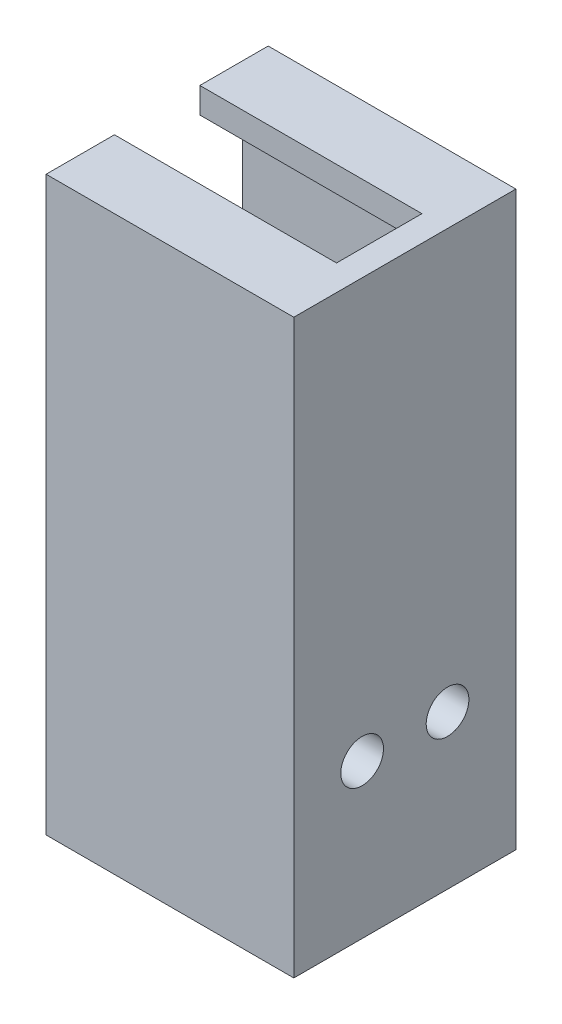
ISO-10303-21;
HEADER;
FILE_DESCRIPTION(('STEP AP214'),'2;1');
FILE_NAME('part.step','',(''),(''),'','','');
FILE_SCHEMA(('AUTOMOTIVE_DESIGN { 1 0 10303 214 1 1 1 1 }'));
ENDSEC;
DATA;
#1=APPLICATION_CONTEXT('core data for automotive mechanical design processes');
#2=APPLICATION_PROTOCOL_DEFINITION('international standard','automotive_design',2000,#1);
#3=PRODUCT_CONTEXT('',#1,'mechanical');
#4=PRODUCT('Part','Part','',(#3));
#5=PRODUCT_RELATED_PRODUCT_CATEGORY('part','',(#4));
#6=PRODUCT_DEFINITION_FORMATION('','',#4);
#7=PRODUCT_DEFINITION_CONTEXT('part definition',#1,'design');
#8=PRODUCT_DEFINITION('design','',#6,#7);
#9=PRODUCT_DEFINITION_SHAPE('','',#8);
#10=(LENGTH_UNIT() NAMED_UNIT(*) SI_UNIT(.MILLI.,.METRE.));
#11=(NAMED_UNIT(*) PLANE_ANGLE_UNIT() SI_UNIT($,.RADIAN.));
#12=(NAMED_UNIT(*) SI_UNIT($,.STERADIAN.) SOLID_ANGLE_UNIT());
#13=UNCERTAINTY_MEASURE_WITH_UNIT(LENGTH_MEASURE(1.E-05),#10,'distance_accuracy_value','');
#14=(GEOMETRIC_REPRESENTATION_CONTEXT(3) GLOBAL_UNCERTAINTY_ASSIGNED_CONTEXT((#13)) GLOBAL_UNIT_ASSIGNED_CONTEXT((#10,
#11,#12)) REPRESENTATION_CONTEXT('',''));
#15=CARTESIAN_POINT('',(0.,0.,0.));
#16=DIRECTION('',(0.,0.,1.));
#17=DIRECTION('',(1.,0.,0.));
#18=AXIS2_PLACEMENT_3D('',#15,#16,#17);
#19=CARTESIAN_POINT('',(0.,44.,26.));
#20=DIRECTION('',(0.,-1.,0.));
#21=DIRECTION('',(0.,0.,-1.));
#22=AXIS2_PLACEMENT_3D('',#19,#20,#21);
#23=PLANE('',#22);
#24=DIRECTION('',(-1.,0.,0.));
#25=VECTOR('',#24,1.);
#26=CARTESIAN_POINT('',(0.,44.,18.));
#27=LINE('',#26,#25);
#28=CARTESIAN_POINT('',(26.,44.,18.));
#29=VERTEX_POINT('',#28);
#30=CARTESIAN_POINT('',(0.,44.,18.));
#31=VERTEX_POINT('',#30);
#32=EDGE_CURVE('E11',#29,#31,#27,.T.);
#33=ORIENTED_EDGE('',*,*,#32,.F.);
#34=DIRECTION('',(0.,0.,-1.));
#35=VECTOR('',#34,1.);
#36=CARTESIAN_POINT('',(26.,44.,26.));
#37=LINE('',#36,#35);
#38=CARTESIAN_POINT('',(26.,44.,23.));
#39=VERTEX_POINT('',#38);
#40=EDGE_CURVE('E206',#39,#29,#37,.T.);
#41=ORIENTED_EDGE('',*,*,#40,.F.);
#42=DIRECTION('',(-1.,0.,0.));
#43=VECTOR('',#42,1.);
#44=CARTESIAN_POINT('',(0.,44.,23.));
#45=LINE('',#44,#43);
#46=CARTESIAN_POINT('',(0.,44.,23.));
#47=VERTEX_POINT('',#46);
#48=EDGE_CURVE('E221',#39,#47,#45,.T.);
#49=ORIENTED_EDGE('',*,*,#48,.T.);
#50=DIRECTION('',(0.,0.,-1.));
#51=VECTOR('',#50,1.);
#52=CARTESIAN_POINT('',(0.,44.,26.));
#53=LINE('',#52,#51);
#54=EDGE_CURVE('E233',#47,#31,#53,.T.);
#55=ORIENTED_EDGE('',*,*,#54,.T.);
#56=EDGE_LOOP('',(#33,#41,#49,#55));
#57=FACE_BOUND('',#56,.T.);
#58=ADVANCED_FACE('F39',(#57),#23,.T.);
#59=CARTESIAN_POINT('',(0.,0.,26.));
#60=DIRECTION('',(1.,0.,0.));
#61=DIRECTION('',(0.,1.,0.));
#62=AXIS2_PLACEMENT_3D('',#59,#60,#61);
#63=PLANE('',#62);
#64=CARTESIAN_POINT('',(0.,-2.,8.));
#65=DIRECTION('',(-1.,0.,0.));
#66=DIRECTION('',(0.,-1.,0.));
#67=AXIS2_PLACEMENT_3D('',#64,#65,#66);
#68=CIRCLE('',#67,2.5);
#69=CARTESIAN_POINT('',(0.,-4.5,8.));
#70=VERTEX_POINT('',#69);
#71=EDGE_CURVE('E163',#70,#70,#68,.T.);
#72=ORIENTED_EDGE('',*,*,#71,.F.);
#73=EDGE_LOOP('',(#72));
#74=FACE_BOUND('',#73,.T.);
#75=CARTESIAN_POINT('',(0.,-2.,18.));
#76=DIRECTION('',(-1.,0.,0.));
#77=DIRECTION('',(0.,-1.,0.));
#78=AXIS2_PLACEMENT_3D('',#75,#76,#77);
#79=CIRCLE('',#78,2.49999999999999);
#80=CARTESIAN_POINT('',(0.,-4.5,18.));
#81=VERTEX_POINT('',#80);
#82=EDGE_CURVE('E166',#81,#81,#79,.T.);
#83=ORIENTED_EDGE('',*,*,#82,.F.);
#84=EDGE_LOOP('',(#83));
#85=FACE_BOUND('',#84,.T.);
#86=DIRECTION('',(0.,0.,-1.));
#87=VECTOR('',#86,1.);
#88=CARTESIAN_POINT('',(0.,47.,26.));
#89=LINE('',#88,#87);
#90=CARTESIAN_POINT('',(0.,47.,26.));
#91=VERTEX_POINT('',#90);
#92=CARTESIAN_POINT('',(0.,47.,18.));
#93=VERTEX_POINT('',#92);
#94=EDGE_CURVE('E254',#91,#93,#89,.T.);
#95=ORIENTED_EDGE('',*,*,#94,.T.);
#96=DIRECTION('',(0.,1.,0.));
#97=VECTOR('',#96,1.);
#98=CARTESIAN_POINT('',(0.,39.8846153846153,18.));
#99=LINE('',#98,#97);
#100=EDGE_CURVE('E173',#31,#93,#99,.T.);
#101=ORIENTED_EDGE('',*,*,#100,.F.);
#102=ORIENTED_EDGE('',*,*,#54,.F.);
#103=DIRECTION('',(0.,-1.,0.));
#104=VECTOR('',#103,1.);
#105=CARTESIAN_POINT('',(0.,0.,23.));
#106=LINE('',#105,#104);
#107=CARTESIAN_POINT('',(0.,3.,23.));
#108=VERTEX_POINT('',#107);
#109=EDGE_CURVE('E63',#47,#108,#106,.T.);
#110=ORIENTED_EDGE('',*,*,#109,.T.);
#111=DIRECTION('',(0.,0.,-1.));
#112=VECTOR('',#111,1.);
#113=CARTESIAN_POINT('',(0.,3.,26.));
#114=LINE('',#113,#112);
#115=CARTESIAN_POINT('',(0.,3.,3.));
#116=VERTEX_POINT('',#115);
#117=EDGE_CURVE('E143',#108,#116,#114,.T.);
#118=ORIENTED_EDGE('',*,*,#117,.T.);
#119=DIRECTION('',(0.,-1.,0.));
#120=VECTOR('',#119,1.);
#121=CARTESIAN_POINT('',(0.,0.,3.));
#122=LINE('',#121,#120);
#123=CARTESIAN_POINT('',(0.,44.,3.));
#124=VERTEX_POINT('',#123);
#125=EDGE_CURVE('E197',#124,#116,#122,.T.);
#126=ORIENTED_EDGE('',*,*,#125,.F.);
#127=CARTESIAN_POINT('',(0.,44.,8.));
#128=VERTEX_POINT('',#127);
#129=EDGE_CURVE('E227',#128,#124,#53,.T.);
#130=ORIENTED_EDGE('',*,*,#129,.F.);
#131=DIRECTION('',(0.,-1.,0.));
#132=VECTOR('',#131,1.);
#133=CARTESIAN_POINT('',(0.,39.8846153846153,8.));
#134=LINE('',#133,#132);
#135=CARTESIAN_POINT('',(0.,47.,8.));
#136=VERTEX_POINT('',#135);
#137=EDGE_CURVE('E178',#136,#128,#134,.T.);
#138=ORIENTED_EDGE('',*,*,#137,.F.);
#139=CARTESIAN_POINT('',(0.,47.,0.));
#140=VERTEX_POINT('',#139);
#141=EDGE_CURVE('E137',#136,#140,#89,.T.);
#142=ORIENTED_EDGE('',*,*,#141,.T.);
#143=DIRECTION('',(0.,-1.,0.));
#144=VECTOR('',#143,1.);
#145=CARTESIAN_POINT('',(0.,0.,0.));
#146=LINE('',#145,#144);
#147=CARTESIAN_POINT('',(0.,-20.,0.));
#148=VERTEX_POINT('',#147);
#149=EDGE_CURVE('E129',#140,#148,#146,.T.);
#150=ORIENTED_EDGE('',*,*,#149,.T.);
#151=DIRECTION('',(0.,0.,-1.));
#152=VECTOR('',#151,1.);
#153=CARTESIAN_POINT('',(0.,-20.,0.));
#154=LINE('',#153,#152);
#155=CARTESIAN_POINT('',(0.,-20.,26.));
#156=VERTEX_POINT('',#155);
#157=EDGE_CURVE('E134',#156,#148,#154,.T.);
#158=ORIENTED_EDGE('',*,*,#157,.F.);
#159=DIRECTION('',(0.,-1.,0.));
#160=VECTOR('',#159,1.);
#161=CARTESIAN_POINT('',(0.,0.,26.));
#162=LINE('',#161,#160);
#163=EDGE_CURVE('E240',#91,#156,#162,.T.);
#164=ORIENTED_EDGE('',*,*,#163,.F.);
#165=EDGE_LOOP('',(#95,#101,#102,#110,#118,#126,#130,#138,#142,#150,#158,#164));
#166=FACE_BOUND('',#165,.T.);
#167=ADVANCED_FACE('F41',(#74,#85,#166),#63,.F.);
#168=CARTESIAN_POINT('',(29.,0.,26.));
#169=DIRECTION('',(-1.,0.,0.));
#170=DIRECTION('',(0.,-1.,0.));
#171=AXIS2_PLACEMENT_3D('',#168,#169,#170);
#172=PLANE('',#171);
#173=CARTESIAN_POINT('',(29.,-2.00000000000001,8.));
#174=DIRECTION('',(-1.,0.,0.));
#175=DIRECTION('',(0.,-1.,0.));
#176=AXIS2_PLACEMENT_3D('',#173,#174,#175);
#177=CIRCLE('',#176,2.5);
#178=CARTESIAN_POINT('',(29.,-4.50000000000001,8.));
#179=VERTEX_POINT('',#178);
#180=EDGE_CURVE('E159',#179,#179,#177,.T.);
#181=ORIENTED_EDGE('',*,*,#180,.T.);
#182=EDGE_LOOP('',(#181));
#183=FACE_BOUND('',#182,.T.);
#184=CARTESIAN_POINT('',(29.,-2.00000000000001,18.));
#185=DIRECTION('',(-1.,0.,0.));
#186=DIRECTION('',(0.,-1.,0.));
#187=AXIS2_PLACEMENT_3D('',#184,#185,#186);
#188=CIRCLE('',#187,2.49999999999999);
#189=CARTESIAN_POINT('',(29.,-4.5,18.));
#190=VERTEX_POINT('',#189);
#191=EDGE_CURVE('E324',#190,#190,#188,.T.);
#192=ORIENTED_EDGE('',*,*,#191,.T.);
#193=EDGE_LOOP('',(#192));
#194=FACE_BOUND('',#193,.T.);
#195=DIRECTION('',(0.,1.,0.));
#196=VECTOR('',#195,1.);
#197=CARTESIAN_POINT('',(29.,0.,0.));
#198=LINE('',#197,#196);
#199=CARTESIAN_POINT('',(29.,-20.,0.));
#200=VERTEX_POINT('',#199);
#201=CARTESIAN_POINT('',(29.,47.,0.));
#202=VERTEX_POINT('',#201);
#203=EDGE_CURVE('E142',#200,#202,#198,.T.);
#204=ORIENTED_EDGE('',*,*,#203,.T.);
#205=DIRECTION('',(0.,0.,-1.));
#206=VECTOR('',#205,1.);
#207=CARTESIAN_POINT('',(29.,47.,26.));
#208=LINE('',#207,#206);
#209=CARTESIAN_POINT('',(29.,47.,26.));
#210=VERTEX_POINT('',#209);
#211=EDGE_CURVE('E257',#210,#202,#208,.T.);
#212=ORIENTED_EDGE('',*,*,#211,.F.);
#213=DIRECTION('',(0.,1.,0.));
#214=VECTOR('',#213,1.);
#215=CARTESIAN_POINT('',(29.,0.,26.));
#216=LINE('',#215,#214);
#217=CARTESIAN_POINT('',(29.,-20.,26.));
#218=VERTEX_POINT('',#217);
#219=EDGE_CURVE('E243',#218,#210,#216,.T.);
#220=ORIENTED_EDGE('',*,*,#219,.F.);
#221=DIRECTION('',(0.,0.,1.));
#222=VECTOR('',#221,1.);
#223=CARTESIAN_POINT('',(29.,-20.,0.));
#224=LINE('',#223,#222);
#225=EDGE_CURVE('E152',#200,#218,#224,.T.);
#226=ORIENTED_EDGE('',*,*,#225,.F.);
#227=EDGE_LOOP('',(#204,#212,#220,#226));
#228=FACE_BOUND('',#227,.T.);
#229=ADVANCED_FACE('F297',(#183,#194,#228),#172,.F.);
#230=CARTESIAN_POINT('',(0.,47.,26.));
#231=DIRECTION('',(0.,-1.,0.));
#232=DIRECTION('',(0.,0.,-1.));
#233=AXIS2_PLACEMENT_3D('',#230,#231,#232);
#234=PLANE('',#233);
#235=DIRECTION('',(0.,0.,1.));
#236=VECTOR('',#235,1.);
#237=CARTESIAN_POINT('',(26.,47.,26.));
#238=LINE('',#237,#236);
#239=CARTESIAN_POINT('',(26.,47.,8.));
#240=VERTEX_POINT('',#239);
#241=CARTESIAN_POINT('',(26.,47.,18.));
#242=VERTEX_POINT('',#241);
#243=EDGE_CURVE('E181',#240,#242,#238,.T.);
#244=ORIENTED_EDGE('',*,*,#243,.T.);
#245=DIRECTION('',(-1.,0.,0.));
#246=VECTOR('',#245,1.);
#247=CARTESIAN_POINT('',(0.,47.,18.));
#248=LINE('',#247,#246);
#249=EDGE_CURVE('E193',#242,#93,#248,.T.);
#250=ORIENTED_EDGE('',*,*,#249,.T.);
#251=ORIENTED_EDGE('',*,*,#94,.F.);
#252=DIRECTION('',(-1.,0.,0.));
#253=VECTOR('',#252,1.);
#254=CARTESIAN_POINT('',(0.,47.,26.));
#255=LINE('',#254,#253);
#256=EDGE_CURVE('E247',#210,#91,#255,.T.);
#257=ORIENTED_EDGE('',*,*,#256,.F.);
#258=ORIENTED_EDGE('',*,*,#211,.T.);
#259=DIRECTION('',(-1.,0.,0.));
#260=VECTOR('',#259,1.);
#261=CARTESIAN_POINT('',(0.,47.,0.));
#262=LINE('',#261,#260);
#263=EDGE_CURVE('E244',#202,#140,#262,.T.);
#264=ORIENTED_EDGE('',*,*,#263,.T.);
#265=ORIENTED_EDGE('',*,*,#141,.F.);
#266=DIRECTION('',(1.,0.,0.));
#267=VECTOR('',#266,1.);
#268=CARTESIAN_POINT('',(0.,47.,8.));
#269=LINE('',#268,#267);
#270=EDGE_CURVE('E189',#136,#240,#269,.T.);
#271=ORIENTED_EDGE('',*,*,#270,.T.);
#272=EDGE_LOOP('',(#244,#250,#251,#257,#258,#264,#265,#271));
#273=FACE_BOUND('',#272,.T.);
#274=ADVANCED_FACE('F309',(#273),#234,.F.);
#275=CARTESIAN_POINT('',(0.,0.,26.));
#276=DIRECTION('',(0.,0.,-1.));
#277=DIRECTION('',(-1.,0.,0.));
#278=AXIS2_PLACEMENT_3D('',#275,#276,#277);
#279=PLANE('',#278);
#280=ORIENTED_EDGE('',*,*,#163,.T.);
#281=DIRECTION('',(-1.,0.,0.));
#282=VECTOR('',#281,1.);
#283=CARTESIAN_POINT('',(0.,-20.,26.));
#284=LINE('',#283,#282);
#285=EDGE_CURVE('E157',#218,#156,#284,.T.);
#286=ORIENTED_EDGE('',*,*,#285,.F.);
#287=ORIENTED_EDGE('',*,*,#219,.T.);
#288=ORIENTED_EDGE('',*,*,#256,.T.);
#289=EDGE_LOOP('',(#280,#286,#287,#288));
#290=FACE_BOUND('',#289,.T.);
#291=ADVANCED_FACE('F306',(#290),#279,.F.);
#292=CARTESIAN_POINT('',(0.,0.,0.));
#293=DIRECTION('',(0.,0.,-1.));
#294=DIRECTION('',(-1.,0.,0.));
#295=AXIS2_PLACEMENT_3D('',#292,#293,#294);
#296=PLANE('',#295);
#297=ORIENTED_EDGE('',*,*,#149,.F.);
#298=ORIENTED_EDGE('',*,*,#263,.F.);
#299=ORIENTED_EDGE('',*,*,#203,.F.);
#300=DIRECTION('',(1.,0.,0.));
#301=VECTOR('',#300,1.);
#302=CARTESIAN_POINT('',(0.,-20.,0.));
#303=LINE('',#302,#301);
#304=EDGE_CURVE('E146',#148,#200,#303,.T.);
#305=ORIENTED_EDGE('',*,*,#304,.F.);
#306=EDGE_LOOP('',(#297,#298,#299,#305));
#307=FACE_BOUND('',#306,.T.);
#308=ADVANCED_FACE('F147',(#307),#296,.T.);
#309=CARTESIAN_POINT('',(0.,3.,26.));
#310=DIRECTION('',(0.,1.,0.));
#311=DIRECTION('',(0.,0.,1.));
#312=AXIS2_PLACEMENT_3D('',#309,#310,#311);
#313=PLANE('',#312);
#314=DIRECTION('',(1.,0.,0.));
#315=VECTOR('',#314,1.);
#316=CARTESIAN_POINT('',(0.,3.,3.));
#317=LINE('',#316,#315);
#318=CARTESIAN_POINT('',(26.,3.,3.));
#319=VERTEX_POINT('',#318);
#320=EDGE_CURVE('E198',#116,#319,#317,.T.);
#321=ORIENTED_EDGE('',*,*,#320,.F.);
#322=ORIENTED_EDGE('',*,*,#117,.F.);
#323=DIRECTION('',(1.,0.,0.));
#324=VECTOR('',#323,1.);
#325=CARTESIAN_POINT('',(0.,3.,23.));
#326=LINE('',#325,#324);
#327=CARTESIAN_POINT('',(26.,3.,23.));
#328=VERTEX_POINT('',#327);
#329=EDGE_CURVE('E207',#108,#328,#326,.T.);
#330=ORIENTED_EDGE('',*,*,#329,.T.);
#331=DIRECTION('',(0.,0.,-1.));
#332=VECTOR('',#331,1.);
#333=CARTESIAN_POINT('',(26.,3.,26.));
#334=LINE('',#333,#332);
#335=EDGE_CURVE('E202',#328,#319,#334,.T.);
#336=ORIENTED_EDGE('',*,*,#335,.T.);
#337=EDGE_LOOP('',(#321,#322,#330,#336));
#338=FACE_BOUND('',#337,.T.);
#339=ADVANCED_FACE('F278',(#338),#313,.T.);
#340=CARTESIAN_POINT('',(26.,0.,26.));
#341=DIRECTION('',(-1.,0.,0.));
#342=DIRECTION('',(0.,-1.,0.));
#343=AXIS2_PLACEMENT_3D('',#340,#341,#342);
#344=PLANE('',#343);
#345=ORIENTED_EDGE('',*,*,#40,.T.);
#346=DIRECTION('',(0.,1.,0.));
#347=VECTOR('',#346,1.);
#348=CARTESIAN_POINT('',(26.,39.8846153846153,18.));
#349=LINE('',#348,#347);
#350=EDGE_CURVE('E174',#29,#242,#349,.T.);
#351=ORIENTED_EDGE('',*,*,#350,.T.);
#352=ORIENTED_EDGE('',*,*,#243,.F.);
#353=DIRECTION('',(0.,-1.,0.));
#354=VECTOR('',#353,1.);
#355=CARTESIAN_POINT('',(26.,39.8846153846153,8.));
#356=LINE('',#355,#354);
#357=CARTESIAN_POINT('',(26.,44.,8.));
#358=VERTEX_POINT('',#357);
#359=EDGE_CURVE('E55',#240,#358,#356,.T.);
#360=ORIENTED_EDGE('',*,*,#359,.T.);
#361=CARTESIAN_POINT('',(26.,44.,3.));
#362=VERTEX_POINT('',#361);
#363=EDGE_CURVE('E218',#358,#362,#37,.T.);
#364=ORIENTED_EDGE('',*,*,#363,.T.);
#365=DIRECTION('',(0.,1.,0.));
#366=VECTOR('',#365,1.);
#367=CARTESIAN_POINT('',(26.,0.,3.));
#368=LINE('',#367,#366);
#369=EDGE_CURVE('E201',#319,#362,#368,.T.);
#370=ORIENTED_EDGE('',*,*,#369,.F.);
#371=ORIENTED_EDGE('',*,*,#335,.F.);
#372=DIRECTION('',(0.,1.,0.));
#373=VECTOR('',#372,1.);
#374=CARTESIAN_POINT('',(26.,0.,23.));
#375=LINE('',#374,#373);
#376=EDGE_CURVE('E210',#328,#39,#375,.T.);
#377=ORIENTED_EDGE('',*,*,#376,.T.);
#378=EDGE_LOOP('',(#345,#351,#352,#360,#364,#370,#371,#377));
#379=FACE_BOUND('',#378,.T.);
#380=ADVANCED_FACE('F281',(#379),#344,.T.);
#381=DIRECTION('',(1.,0.,0.));
#382=VECTOR('',#381,1.);
#383=CARTESIAN_POINT('',(0.,44.,8.));
#384=LINE('',#383,#382);
#385=EDGE_CURVE('E48',#128,#358,#384,.T.);
#386=ORIENTED_EDGE('',*,*,#385,.F.);
#387=ORIENTED_EDGE('',*,*,#129,.T.);
#388=DIRECTION('',(-1.,0.,0.));
#389=VECTOR('',#388,1.);
#390=CARTESIAN_POINT('',(0.,44.,3.));
#391=LINE('',#390,#389);
#392=EDGE_CURVE('E214',#362,#124,#391,.T.);
#393=ORIENTED_EDGE('',*,*,#392,.F.);
#394=ORIENTED_EDGE('',*,*,#363,.F.);
#395=EDGE_LOOP('',(#386,#387,#393,#394));
#396=FACE_BOUND('',#395,.T.);
#397=ADVANCED_FACE('F268',(#396),#23,.T.);
#398=CARTESIAN_POINT('',(0.,0.,23.));
#399=DIRECTION('',(0.,0.,-1.));
#400=DIRECTION('',(-1.,0.,0.));
#401=AXIS2_PLACEMENT_3D('',#398,#399,#400);
#402=PLANE('',#401);
#403=ORIENTED_EDGE('',*,*,#109,.F.);
#404=ORIENTED_EDGE('',*,*,#48,.F.);
#405=ORIENTED_EDGE('',*,*,#376,.F.);
#406=ORIENTED_EDGE('',*,*,#329,.F.);
#407=EDGE_LOOP('',(#403,#404,#405,#406));
#408=FACE_BOUND('',#407,.T.);
#409=ADVANCED_FACE('F289',(#408),#402,.T.);
#410=CARTESIAN_POINT('',(0.,0.,3.));
#411=DIRECTION('',(0.,0.,-1.));
#412=DIRECTION('',(-1.,0.,0.));
#413=AXIS2_PLACEMENT_3D('',#410,#411,#412);
#414=PLANE('',#413);
#415=ORIENTED_EDGE('',*,*,#125,.T.);
#416=ORIENTED_EDGE('',*,*,#320,.T.);
#417=ORIENTED_EDGE('',*,*,#369,.T.);
#418=ORIENTED_EDGE('',*,*,#392,.T.);
#419=EDGE_LOOP('',(#415,#416,#417,#418));
#420=FACE_BOUND('',#419,.T.);
#421=ADVANCED_FACE('F274',(#420),#414,.F.);
#422=CARTESIAN_POINT('',(26.,39.8846153846153,18.));
#423=DIRECTION('',(0.,0.,1.));
#424=DIRECTION('',(1.,0.,0.));
#425=AXIS2_PLACEMENT_3D('',#422,#423,#424);
#426=PLANE('',#425);
#427=ORIENTED_EDGE('',*,*,#350,.F.);
#428=ORIENTED_EDGE('',*,*,#32,.T.);
#429=ORIENTED_EDGE('',*,*,#100,.T.);
#430=ORIENTED_EDGE('',*,*,#249,.F.);
#431=EDGE_LOOP('',(#427,#428,#429,#430));
#432=FACE_BOUND('',#431,.T.);
#433=ADVANCED_FACE('F305',(#432),#426,.F.);
#434=CARTESIAN_POINT('',(26.,39.8846153846153,8.));
#435=DIRECTION('',(0.,0.,-1.));
#436=DIRECTION('',(-1.,0.,0.));
#437=AXIS2_PLACEMENT_3D('',#434,#435,#436);
#438=PLANE('',#437);
#439=ORIENTED_EDGE('',*,*,#137,.T.);
#440=ORIENTED_EDGE('',*,*,#385,.T.);
#441=ORIENTED_EDGE('',*,*,#359,.F.);
#442=ORIENTED_EDGE('',*,*,#270,.F.);
#443=EDGE_LOOP('',(#439,#440,#441,#442));
#444=FACE_BOUND('',#443,.T.);
#445=ADVANCED_FACE('F264',(#444),#438,.F.);
#446=CARTESIAN_POINT('',(0.,-20.,0.));
#447=DIRECTION('',(0.,1.,0.));
#448=DIRECTION('',(0.,0.,1.));
#449=AXIS2_PLACEMENT_3D('',#446,#447,#448);
#450=PLANE('',#449);
#451=ORIENTED_EDGE('',*,*,#157,.T.);
#452=ORIENTED_EDGE('',*,*,#304,.T.);
#453=ORIENTED_EDGE('',*,*,#225,.T.);
#454=ORIENTED_EDGE('',*,*,#285,.T.);
#455=EDGE_LOOP('',(#451,#452,#453,#454));
#456=FACE_BOUND('',#455,.T.);
#457=ADVANCED_FACE('F155',(#456),#450,.F.);
#458=CARTESIAN_POINT('',(29.,-2.00000000000001,18.));
#459=DIRECTION('',(-1.,0.,0.));
#460=DIRECTION('',(0.,-1.,0.));
#461=AXIS2_PLACEMENT_3D('',#458,#459,#460);
#462=CYLINDRICAL_SURFACE('',#461,2.49999999999999);
#463=CARTESIAN_POINT('',(29.,-4.5,18.));
#464=CARTESIAN_POINT('',(28.6979166666667,-4.5,18.));
#465=CARTESIAN_POINT('',(28.3958333333333,-4.5,18.));
#466=CARTESIAN_POINT('',(27.7916666666667,-4.5,18.));
#467=CARTESIAN_POINT('',(27.4895833333333,-4.5,18.));
#468=CARTESIAN_POINT('',(26.8854166666667,-4.5,18.));
#469=CARTESIAN_POINT('',(26.5833333333333,-4.5,18.));
#470=CARTESIAN_POINT('',(25.9791666666667,-4.5,18.));
#471=CARTESIAN_POINT('',(25.6770833333333,-4.5,18.));
#472=CARTESIAN_POINT('',(25.0729166666667,-4.5,18.));
#473=CARTESIAN_POINT('',(24.7708333333333,-4.5,18.));
#474=CARTESIAN_POINT('',(24.1666666666667,-4.5,18.));
#475=CARTESIAN_POINT('',(23.8645833333333,-4.5,18.));
#476=CARTESIAN_POINT('',(23.2604166666667,-4.5,18.));
#477=CARTESIAN_POINT('',(22.9583333333333,-4.5,18.));
#478=CARTESIAN_POINT('',(22.3541666666667,-4.5,18.));
#479=CARTESIAN_POINT('',(22.0520833333333,-4.5,18.));
#480=CARTESIAN_POINT('',(21.4479166666667,-4.5,18.));
#481=CARTESIAN_POINT('',(21.1458333333333,-4.5,18.));
#482=CARTESIAN_POINT('',(20.5416666666667,-4.5,18.));
#483=CARTESIAN_POINT('',(20.2395833333333,-4.5,18.));
#484=CARTESIAN_POINT('',(19.6354166666667,-4.5,18.));
#485=CARTESIAN_POINT('',(19.3333333333333,-4.5,18.));
#486=CARTESIAN_POINT('',(18.7291666666667,-4.5,18.));
#487=CARTESIAN_POINT('',(18.4270833333333,-4.5,18.));
#488=CARTESIAN_POINT('',(17.8229166666667,-4.5,18.));
#489=CARTESIAN_POINT('',(17.5208333333333,-4.5,18.));
#490=CARTESIAN_POINT('',(16.9166666666667,-4.5,18.));
#491=CARTESIAN_POINT('',(16.6145833333333,-4.5,18.));
#492=CARTESIAN_POINT('',(16.0104166666667,-4.5,18.));
#493=CARTESIAN_POINT('',(15.7083333333333,-4.5,18.));
#494=CARTESIAN_POINT('',(15.1041666666667,-4.5,18.));
#495=CARTESIAN_POINT('',(14.8020833333333,-4.5,18.));
#496=CARTESIAN_POINT('',(14.1979166666667,-4.5,18.));
#497=CARTESIAN_POINT('',(13.8958333333333,-4.5,18.));
#498=CARTESIAN_POINT('',(13.2916666666667,-4.5,18.));
#499=CARTESIAN_POINT('',(12.9895833333333,-4.5,18.));
#500=CARTESIAN_POINT('',(12.3854166666667,-4.5,18.));
#501=CARTESIAN_POINT('',(12.0833333333333,-4.5,18.));
#502=CARTESIAN_POINT('',(11.4791666666667,-4.5,18.));
#503=CARTESIAN_POINT('',(11.1770833333333,-4.5,18.));
#504=CARTESIAN_POINT('',(10.5729166666667,-4.5,18.));
#505=CARTESIAN_POINT('',(10.2708333333333,-4.5,18.));
#506=CARTESIAN_POINT('',(9.66666666666667,-4.5,18.));
#507=CARTESIAN_POINT('',(9.36458333333333,-4.5,18.));
#508=CARTESIAN_POINT('',(8.76041666666667,-4.5,18.));
#509=CARTESIAN_POINT('',(8.45833333333333,-4.5,18.));
#510=CARTESIAN_POINT('',(7.85416666666667,-4.5,18.));
#511=CARTESIAN_POINT('',(7.55208333333333,-4.5,18.));
#512=CARTESIAN_POINT('',(6.94791666666667,-4.5,18.));
#513=CARTESIAN_POINT('',(6.64583333333333,-4.5,18.));
#514=CARTESIAN_POINT('',(6.04166666666667,-4.5,18.));
#515=CARTESIAN_POINT('',(5.73958333333333,-4.5,18.));
#516=CARTESIAN_POINT('',(5.13541666666667,-4.5,18.));
#517=CARTESIAN_POINT('',(4.83333333333333,-4.5,18.));
#518=CARTESIAN_POINT('',(4.22916666666667,-4.5,18.));
#519=CARTESIAN_POINT('',(3.92708333333333,-4.5,18.));
#520=CARTESIAN_POINT('',(3.32291666666667,-4.5,18.));
#521=CARTESIAN_POINT('',(3.02083333333333,-4.5,18.));
#522=CARTESIAN_POINT('',(2.41666666666667,-4.5,18.));
#523=CARTESIAN_POINT('',(2.11458333333333,-4.5,18.));
#524=CARTESIAN_POINT('',(1.51041666666667,-4.5,18.));
#525=CARTESIAN_POINT('',(1.20833333333333,-4.5,18.));
#526=CARTESIAN_POINT('',(0.604166666666667,-4.5,18.));
#527=CARTESIAN_POINT('',(0.302083333333333,-4.5,18.));
#528=CARTESIAN_POINT('',(0.,-4.5,18.));
#529=B_SPLINE_CURVE_WITH_KNOTS('',3,(#463,#464,#465,#466,#467,#468,#469,#470,#471,#472,#473,
#474,#475,#476,#477,#478,#479,#480,#481,#482,#483,#484,#485,#486,#487,#488,#489,#490,#491,#492,
#493,#494,#495,#496,#497,#498,#499,#500,#501,#502,#503,#504,#505,#506,#507,#508,#509,#510,#511,
#512,#513,#514,#515,#516,#517,#518,#519,#520,#521,#522,#523,#524,#525,#526,#527,#528),
.UNSPECIFIED.,.F.,.F.,(4,2,2,2,2,2,2,2,2,2,2,2,2,2,2,2,2,2,2,2,2,2,2,2,2,2,2,2,2,2,2,2,4),(0.,
0.906249999999997,1.8125,2.71875,3.625,4.53125,5.4375,6.34375,7.25,8.15625,9.0625,9.96875,
10.875,11.78125,12.6875,13.59375,14.5,15.40625,16.3125,17.21875,18.125,19.03125,19.9375,
20.84375,21.75,22.65625,23.5625,24.46875,25.375,26.28125,27.1875,28.09375,29.),.UNSPECIFIED.);
#530=EDGE_CURVE('BSEAM340',#190,#81,#529,.T.);
#531=ORIENTED_EDGE('',*,*,#191,.F.);
#532=ORIENTED_EDGE('',*,*,#82,.T.);
#533=ORIENTED_EDGE('',*,*,#530,.T.);
#534=ORIENTED_EDGE('',*,*,#530,.F.);
#535=EDGE_LOOP('',(#531,#533,#532,#534));
#536=FACE_BOUND('',#535,.T.);
#537=ADVANCED_FACE('F340',(#536),#462,.F.);
#538=CARTESIAN_POINT('',(29.,-2.00000000000001,8.));
#539=DIRECTION('',(-1.,0.,0.));
#540=DIRECTION('',(0.,-1.,0.));
#541=AXIS2_PLACEMENT_3D('',#538,#539,#540);
#542=CYLINDRICAL_SURFACE('',#541,2.5);
#543=CARTESIAN_POINT('',(29.,-4.50000000000001,8.));
#544=CARTESIAN_POINT('',(28.6979166666667,-4.50000000000001,8.));
#545=CARTESIAN_POINT('',(28.3958333333333,-4.50000000000001,8.));
#546=CARTESIAN_POINT('',(27.7916666666667,-4.50000000000001,8.));
#547=CARTESIAN_POINT('',(27.4895833333333,-4.50000000000001,8.));
#548=CARTESIAN_POINT('',(26.8854166666667,-4.50000000000001,8.));
#549=CARTESIAN_POINT('',(26.5833333333333,-4.50000000000001,8.));
#550=CARTESIAN_POINT('',(25.9791666666667,-4.50000000000001,8.));
#551=CARTESIAN_POINT('',(25.6770833333333,-4.50000000000001,8.));
#552=CARTESIAN_POINT('',(25.0729166666667,-4.50000000000001,8.));
#553=CARTESIAN_POINT('',(24.7708333333333,-4.50000000000001,8.));
#554=CARTESIAN_POINT('',(24.1666666666667,-4.50000000000001,8.));
#555=CARTESIAN_POINT('',(23.8645833333333,-4.50000000000001,8.));
#556=CARTESIAN_POINT('',(23.2604166666667,-4.50000000000001,8.));
#557=CARTESIAN_POINT('',(22.9583333333333,-4.50000000000001,8.));
#558=CARTESIAN_POINT('',(22.3541666666667,-4.50000000000001,8.));
#559=CARTESIAN_POINT('',(22.0520833333333,-4.50000000000001,8.));
#560=CARTESIAN_POINT('',(21.4479166666667,-4.50000000000001,8.));
#561=CARTESIAN_POINT('',(21.1458333333333,-4.50000000000001,8.));
#562=CARTESIAN_POINT('',(20.5416666666667,-4.50000000000001,8.));
#563=CARTESIAN_POINT('',(20.2395833333333,-4.50000000000001,8.));
#564=CARTESIAN_POINT('',(19.6354166666667,-4.50000000000001,8.));
#565=CARTESIAN_POINT('',(19.3333333333333,-4.5,8.));
#566=CARTESIAN_POINT('',(18.7291666666667,-4.5,8.));
#567=CARTESIAN_POINT('',(18.4270833333333,-4.5,8.));
#568=CARTESIAN_POINT('',(17.8229166666667,-4.5,8.));
#569=CARTESIAN_POINT('',(17.5208333333333,-4.5,8.));
#570=CARTESIAN_POINT('',(16.9166666666667,-4.5,8.));
#571=CARTESIAN_POINT('',(16.6145833333333,-4.5,8.));
#572=CARTESIAN_POINT('',(16.0104166666667,-4.5,8.));
#573=CARTESIAN_POINT('',(15.7083333333333,-4.5,8.));
#574=CARTESIAN_POINT('',(15.1041666666667,-4.5,8.));
#575=CARTESIAN_POINT('',(14.8020833333333,-4.5,8.));
#576=CARTESIAN_POINT('',(14.1979166666667,-4.5,8.));
#577=CARTESIAN_POINT('',(13.8958333333333,-4.5,8.));
#578=CARTESIAN_POINT('',(13.2916666666667,-4.5,8.));
#579=CARTESIAN_POINT('',(12.9895833333333,-4.5,8.));
#580=CARTESIAN_POINT('',(12.3854166666667,-4.5,8.));
#581=CARTESIAN_POINT('',(12.0833333333333,-4.5,8.));
#582=CARTESIAN_POINT('',(11.4791666666667,-4.5,8.));
#583=CARTESIAN_POINT('',(11.1770833333333,-4.5,8.));
#584=CARTESIAN_POINT('',(10.5729166666667,-4.5,8.));
#585=CARTESIAN_POINT('',(10.2708333333333,-4.5,8.));
#586=CARTESIAN_POINT('',(9.66666666666667,-4.5,8.));
#587=CARTESIAN_POINT('',(9.36458333333333,-4.5,8.));
#588=CARTESIAN_POINT('',(8.76041666666667,-4.5,8.));
#589=CARTESIAN_POINT('',(8.45833333333333,-4.5,8.));
#590=CARTESIAN_POINT('',(7.85416666666667,-4.5,8.));
#591=CARTESIAN_POINT('',(7.55208333333333,-4.5,8.));
#592=CARTESIAN_POINT('',(6.94791666666667,-4.5,8.));
#593=CARTESIAN_POINT('',(6.64583333333333,-4.5,8.));
#594=CARTESIAN_POINT('',(6.04166666666667,-4.5,8.));
#595=CARTESIAN_POINT('',(5.73958333333333,-4.5,8.));
#596=CARTESIAN_POINT('',(5.13541666666667,-4.5,8.));
#597=CARTESIAN_POINT('',(4.83333333333333,-4.5,8.));
#598=CARTESIAN_POINT('',(4.22916666666667,-4.5,8.));
#599=CARTESIAN_POINT('',(3.92708333333333,-4.5,8.));
#600=CARTESIAN_POINT('',(3.32291666666667,-4.5,8.));
#601=CARTESIAN_POINT('',(3.02083333333333,-4.5,8.));
#602=CARTESIAN_POINT('',(2.41666666666667,-4.5,8.));
#603=CARTESIAN_POINT('',(2.11458333333333,-4.5,8.));
#604=CARTESIAN_POINT('',(1.51041666666667,-4.5,8.));
#605=CARTESIAN_POINT('',(1.20833333333333,-4.5,8.));
#606=CARTESIAN_POINT('',(0.604166666666667,-4.5,8.));
#607=CARTESIAN_POINT('',(0.302083333333333,-4.5,8.));
#608=CARTESIAN_POINT('',(0.,-4.5,8.));
#609=B_SPLINE_CURVE_WITH_KNOTS('',3,(#543,#544,#545,#546,#547,#548,#549,#550,#551,#552,#553,
#554,#555,#556,#557,#558,#559,#560,#561,#562,#563,#564,#565,#566,#567,#568,#569,#570,#571,#572,
#573,#574,#575,#576,#577,#578,#579,#580,#581,#582,#583,#584,#585,#586,#587,#588,#589,#590,#591,
#592,#593,#594,#595,#596,#597,#598,#599,#600,#601,#602,#603,#604,#605,#606,#607,#608),
.UNSPECIFIED.,.F.,.F.,(4,2,2,2,2,2,2,2,2,2,2,2,2,2,2,2,2,2,2,2,2,2,2,2,2,2,2,2,2,2,2,2,4),(0.,
0.906249999999997,1.8125,2.71875,3.625,4.53125,5.4375,6.34375,7.25,8.15625,9.0625,9.96875,
10.875,11.78125,12.6875,13.59375,14.5,15.40625,16.3125,17.21875,18.125,19.03125,19.9375,
20.84375,21.75,22.65625,23.5625,24.46875,25.375,26.28125,27.1875,28.09375,29.),.UNSPECIFIED.);
#610=EDGE_CURVE('BSEAM343',#179,#70,#609,.T.);
#611=ORIENTED_EDGE('',*,*,#180,.F.);
#612=ORIENTED_EDGE('',*,*,#71,.T.);
#613=ORIENTED_EDGE('',*,*,#610,.T.);
#614=ORIENTED_EDGE('',*,*,#610,.F.);
#615=EDGE_LOOP('',(#611,#613,#612,#614));
#616=FACE_BOUND('',#615,.T.);
#617=ADVANCED_FACE('F343',(#616),#542,.F.);
#618=CLOSED_SHELL('',(#58,#167,#229,#274,#291,#308,#339,#380,#397,#409,#421,#433,#445,#457,#537,#617));
#619=MANIFOLD_SOLID_BREP('B2',#618);
#620=ADVANCED_BREP_SHAPE_REPRESENTATION('',(#18,#619),#14);
#621=SHAPE_DEFINITION_REPRESENTATION(#9,#620);
ENDSEC;
END-ISO-10303-21;
